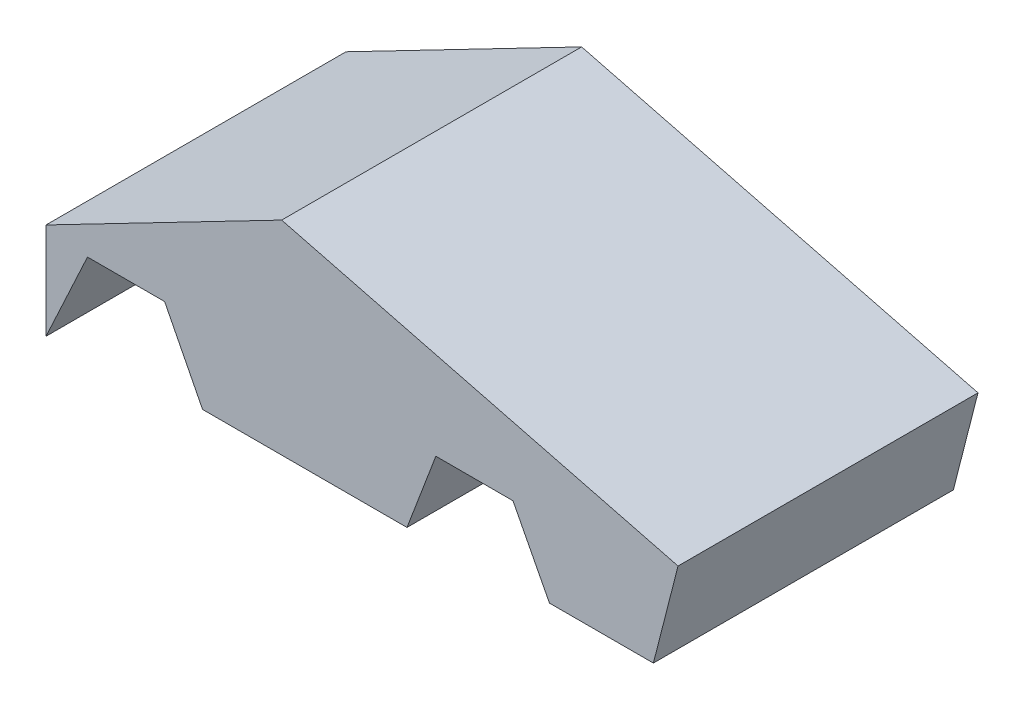
ISO-10303-21;
HEADER;
FILE_DESCRIPTION(('STEP AP214'),'2;1');
FILE_NAME('part.step','',(''),(''),'','','');
FILE_SCHEMA(('AUTOMOTIVE_DESIGN { 1 0 10303 214 1 1 1 1 }'));
ENDSEC;
DATA;
#1=APPLICATION_CONTEXT('core data for automotive mechanical design processes');
#2=APPLICATION_PROTOCOL_DEFINITION('international standard','automotive_design',2000,#1);
#3=PRODUCT_CONTEXT('',#1,'mechanical');
#4=PRODUCT('Part','Part','',(#3));
#5=PRODUCT_RELATED_PRODUCT_CATEGORY('part','',(#4));
#6=PRODUCT_DEFINITION_FORMATION('','',#4);
#7=PRODUCT_DEFINITION_CONTEXT('part definition',#1,'design');
#8=PRODUCT_DEFINITION('design','',#6,#7);
#9=PRODUCT_DEFINITION_SHAPE('','',#8);
#10=(LENGTH_UNIT() NAMED_UNIT(*) SI_UNIT(.MILLI.,.METRE.));
#11=(NAMED_UNIT(*) PLANE_ANGLE_UNIT() SI_UNIT($,.RADIAN.));
#12=(NAMED_UNIT(*) SI_UNIT($,.STERADIAN.) SOLID_ANGLE_UNIT());
#13=UNCERTAINTY_MEASURE_WITH_UNIT(LENGTH_MEASURE(1.E-05),#10,'distance_accuracy_value','');
#14=(GEOMETRIC_REPRESENTATION_CONTEXT(3) GLOBAL_UNCERTAINTY_ASSIGNED_CONTEXT((#13)) GLOBAL_UNIT_ASSIGNED_CONTEXT((#10,
#11,#12)) REPRESENTATION_CONTEXT('',''));
#15=CARTESIAN_POINT('',(0.,0.,0.));
#16=DIRECTION('',(0.,0.,1.));
#17=DIRECTION('',(1.,0.,0.));
#18=AXIS2_PLACEMENT_3D('',#15,#16,#17);
#19=CARTESIAN_POINT('',(176.391501363352,-13.2896946294836,140.));
#20=DIRECTION('',(0.,1.,0.));
#21=DIRECTION('',(-1.,0.,0.));
#22=AXIS2_PLACEMENT_3D('',#19,#20,#21);
#23=PLANE('',#22);
#24=DIRECTION('',(1.,0.,0.));
#25=VECTOR('',#24,1.);
#26=CARTESIAN_POINT('',(176.391501363352,-13.2896946294836,0.));
#27=LINE('',#26,#25);
#28=CARTESIAN_POINT('',(176.391501363352,-13.2896946294836,0.));
#29=VERTEX_POINT('',#28);
#30=CARTESIAN_POINT('',(212.391501363352,-13.2896946294836,0.));
#31=VERTEX_POINT('',#30);
#32=EDGE_CURVE('E153',#29,#31,#27,.T.);
#33=ORIENTED_EDGE('',*,*,#32,.T.);
#34=DIRECTION('',(0.,0.,-1.));
#35=VECTOR('',#34,1.);
#36=CARTESIAN_POINT('',(212.391501363352,-13.2896946294836,140.));
#37=LINE('',#36,#35);
#38=CARTESIAN_POINT('',(212.391501363352,-13.2896946294836,140.));
#39=VERTEX_POINT('',#38);
#40=EDGE_CURVE('E11',#39,#31,#37,.T.);
#41=ORIENTED_EDGE('',*,*,#40,.F.);
#42=DIRECTION('',(1.,0.,0.));
#43=VECTOR('',#42,1.);
#44=CARTESIAN_POINT('',(176.391501363352,-13.2896946294836,140.));
#45=LINE('',#44,#43);
#46=CARTESIAN_POINT('',(176.391501363352,-13.2896946294836,140.));
#47=VERTEX_POINT('',#46);
#48=EDGE_CURVE('E175',#47,#39,#45,.T.);
#49=ORIENTED_EDGE('',*,*,#48,.F.);
#50=DIRECTION('',(0.,0.,-1.));
#51=VECTOR('',#50,1.);
#52=CARTESIAN_POINT('',(176.391501363352,-13.2896946294836,140.));
#53=LINE('',#52,#51);
#54=EDGE_CURVE('E149',#47,#29,#53,.T.);
#55=ORIENTED_EDGE('',*,*,#54,.T.);
#56=EDGE_LOOP('',(#33,#41,#49,#55));
#57=FACE_BOUND('',#56,.T.);
#58=ADVANCED_FACE('F33',(#57),#23,.F.);
#59=CARTESIAN_POINT('',(212.391501363352,-13.2896946294836,140.));
#60=DIRECTION('',(0.887963935592456,0.459913088623445,0.));
#61=DIRECTION('',(-0.459913088623445,0.887963935592456,0.));
#62=AXIS2_PLACEMENT_3D('',#59,#60,#61);
#63=PLANE('',#62);
#64=DIRECTION('',(0.459913088623445,-0.887963935592456,0.));
#65=VECTOR('',#64,1.);
#66=CARTESIAN_POINT('',(212.391501363352,-13.2896946294836,0.));
#67=LINE('',#66,#65);
#68=CARTESIAN_POINT('',(229.40828564242,-46.1443602464045,0.));
#69=VERTEX_POINT('',#68);
#70=EDGE_CURVE('E156',#31,#69,#67,.T.);
#71=ORIENTED_EDGE('',*,*,#70,.T.);
#72=DIRECTION('',(0.,0.,-1.));
#73=VECTOR('',#72,1.);
#74=CARTESIAN_POINT('',(229.40828564242,-46.1443602464045,140.));
#75=LINE('',#74,#73);
#76=CARTESIAN_POINT('',(229.40828564242,-46.1443602464045,140.));
#77=VERTEX_POINT('',#76);
#78=EDGE_CURVE('E41',#77,#69,#75,.T.);
#79=ORIENTED_EDGE('',*,*,#78,.F.);
#80=DIRECTION('',(0.459913088623445,-0.887963935592456,0.));
#81=VECTOR('',#80,1.);
#82=CARTESIAN_POINT('',(212.391501363352,-13.2896946294836,140.));
#83=LINE('',#82,#81);
#84=EDGE_CURVE('E104',#39,#77,#83,.T.);
#85=ORIENTED_EDGE('',*,*,#84,.F.);
#86=ORIENTED_EDGE('',*,*,#40,.T.);
#87=EDGE_LOOP('',(#71,#79,#85,#86));
#88=FACE_BOUND('',#87,.T.);
#89=ADVANCED_FACE('F253',(#88),#63,.F.);
#90=CARTESIAN_POINT('',(229.40828564242,-46.1443602464045,140.));
#91=DIRECTION('',(0.,1.,0.));
#92=DIRECTION('',(-1.,0.,0.));
#93=AXIS2_PLACEMENT_3D('',#90,#91,#92);
#94=PLANE('',#93);
#95=DIRECTION('',(1.,0.,0.));
#96=VECTOR('',#95,1.);
#97=CARTESIAN_POINT('',(229.40828564242,-46.1443602464045,0.));
#98=LINE('',#97,#96);
#99=CARTESIAN_POINT('',(277.919749318649,-46.1443602464045,0.));
#100=VERTEX_POINT('',#99);
#101=EDGE_CURVE('E158',#69,#100,#98,.T.);
#102=ORIENTED_EDGE('',*,*,#101,.T.);
#103=DIRECTION('',(0.,0.,-1.));
#104=VECTOR('',#103,1.);
#105=CARTESIAN_POINT('',(277.919749318649,-46.1443602464045,140.));
#106=LINE('',#105,#104);
#107=CARTESIAN_POINT('',(277.919749318649,-46.1443602464045,140.));
#108=VERTEX_POINT('',#107);
#109=EDGE_CURVE('E194',#108,#100,#106,.T.);
#110=ORIENTED_EDGE('',*,*,#109,.F.);
#111=DIRECTION('',(1.,0.,0.));
#112=VECTOR('',#111,1.);
#113=CARTESIAN_POINT('',(229.40828564242,-46.1443602464045,140.));
#114=LINE('',#113,#112);
#115=EDGE_CURVE('E202',#77,#108,#114,.T.);
#116=ORIENTED_EDGE('',*,*,#115,.F.);
#117=ORIENTED_EDGE('',*,*,#78,.T.);
#118=EDGE_LOOP('',(#102,#110,#116,#117));
#119=FACE_BOUND('',#118,.T.);
#120=ADVANCED_FACE('F200',(#119),#94,.F.);
#121=CARTESIAN_POINT('',(289.431663255081,-1.14436024640451,140.));
#122=DIRECTION('',(-0.968801225938162,0.247839029655773,0.));
#123=DIRECTION('',(-0.247839029655773,-0.968801225938162,0.));
#124=AXIS2_PLACEMENT_3D('',#121,#122,#123);
#125=PLANE('',#124);
#126=DIRECTION('',(0.247839029655773,0.968801225938162,0.));
#127=VECTOR('',#126,1.);
#128=CARTESIAN_POINT('',(289.431663255081,-1.14436024640451,0.));
#129=LINE('',#128,#127);
#130=CARTESIAN_POINT('',(289.431663255081,-1.14436024640451,0.));
#131=VERTEX_POINT('',#130);
#132=EDGE_CURVE('E160',#100,#131,#129,.T.);
#133=ORIENTED_EDGE('',*,*,#132,.T.);
#134=DIRECTION('',(0.,0.,-1.));
#135=VECTOR('',#134,1.);
#136=CARTESIAN_POINT('',(289.431663255081,-1.14436024640451,140.));
#137=LINE('',#136,#135);
#138=CARTESIAN_POINT('',(289.431663255081,-1.14436024640451,140.));
#139=VERTEX_POINT('',#138);
#140=EDGE_CURVE('E191',#139,#131,#137,.T.);
#141=ORIENTED_EDGE('',*,*,#140,.F.);
#142=DIRECTION('',(0.247839029655773,0.968801225938162,0.));
#143=VECTOR('',#142,1.);
#144=CARTESIAN_POINT('',(289.431663255081,-1.14436024640451,140.));
#145=LINE('',#144,#143);
#146=EDGE_CURVE('E220',#108,#139,#145,.T.);
#147=ORIENTED_EDGE('',*,*,#146,.F.);
#148=ORIENTED_EDGE('',*,*,#109,.T.);
#149=EDGE_LOOP('',(#133,#141,#147,#148));
#150=FACE_BOUND('',#149,.T.);
#151=ADVANCED_FACE('F211',(#150),#125,.F.);
#152=CARTESIAN_POINT('',(104.431663255081,46.1823970478152,140.));
#153=DIRECTION('',(-0.247839029655772,-0.968801225938162,0.));
#154=DIRECTION('',(0.968801225938162,-0.247839029655772,0.));
#155=AXIS2_PLACEMENT_3D('',#152,#153,#154);
#156=PLANE('',#155);
#157=DIRECTION('',(-0.968801225938162,0.247839029655772,0.));
#158=VECTOR('',#157,1.);
#159=CARTESIAN_POINT('',(104.431663255081,46.1823970478152,0.));
#160=LINE('',#159,#158);
#161=CARTESIAN_POINT('',(104.431663255081,46.1823970478152,0.));
#162=VERTEX_POINT('',#161);
#163=EDGE_CURVE('E162',#131,#162,#160,.T.);
#164=ORIENTED_EDGE('',*,*,#163,.T.);
#165=DIRECTION('',(0.,0.,-1.));
#166=VECTOR('',#165,1.);
#167=CARTESIAN_POINT('',(104.431663255081,46.1823970478152,140.));
#168=LINE('',#167,#166);
#169=CARTESIAN_POINT('',(104.431663255081,46.1823970478152,140.));
#170=VERTEX_POINT('',#169);
#171=EDGE_CURVE('E188',#170,#162,#168,.T.);
#172=ORIENTED_EDGE('',*,*,#171,.F.);
#173=DIRECTION('',(-0.968801225938162,0.247839029655772,0.));
#174=VECTOR('',#173,1.);
#175=CARTESIAN_POINT('',(104.431663255081,46.1823970478152,140.));
#176=LINE('',#175,#174);
#177=EDGE_CURVE('E217',#139,#170,#176,.T.);
#178=ORIENTED_EDGE('',*,*,#177,.F.);
#179=ORIENTED_EDGE('',*,*,#140,.T.);
#180=EDGE_LOOP('',(#164,#172,#178,#179));
#181=FACE_BOUND('',#180,.T.);
#182=ADVANCED_FACE('F215',(#181),#156,.F.);
#183=CARTESIAN_POINT('',(104.431663255081,46.1823970478152,140.));
#184=DIRECTION('',(0.459913088623445,-0.887963935592456,0.));
#185=DIRECTION('',(0.887963935592456,0.459913088623445,0.));
#186=AXIS2_PLACEMENT_3D('',#183,#184,#185);
#187=PLANE('',#186);
#188=DIRECTION('',(-0.887963935592456,-0.459913088623445,0.));
#189=VECTOR('',#188,1.);
#190=CARTESIAN_POINT('',(104.431663255081,46.1823970478152,0.));
#191=LINE('',#190,#189);
#192=CARTESIAN_POINT('',(-5.56833674491933,-10.7911327553121,0.));
#193=VERTEX_POINT('',#192);
#194=EDGE_CURVE('E164',#162,#193,#191,.T.);
#195=ORIENTED_EDGE('',*,*,#194,.T.);
#196=DIRECTION('',(0.,0.,-1.));
#197=VECTOR('',#196,1.);
#198=CARTESIAN_POINT('',(-5.56833674491933,-10.7911327553121,140.));
#199=LINE('',#198,#197);
#200=CARTESIAN_POINT('',(-5.56833674491933,-10.7911327553121,140.));
#201=VERTEX_POINT('',#200);
#202=EDGE_CURVE('E185',#201,#193,#199,.T.);
#203=ORIENTED_EDGE('',*,*,#202,.F.);
#204=DIRECTION('',(-0.887963935592456,-0.459913088623445,0.));
#205=VECTOR('',#204,1.);
#206=CARTESIAN_POINT('',(104.431663255081,46.1823970478152,140.));
#207=LINE('',#206,#205);
#208=EDGE_CURVE('E219',#170,#201,#207,.T.);
#209=ORIENTED_EDGE('',*,*,#208,.F.);
#210=ORIENTED_EDGE('',*,*,#171,.T.);
#211=EDGE_LOOP('',(#195,#203,#209,#210));
#212=FACE_BOUND('',#211,.T.);
#213=ADVANCED_FACE('F266',(#212),#187,.F.);
#214=CARTESIAN_POINT('',(-5.56833674491933,-10.7911327553121,140.));
#215=DIRECTION('',(1.,0.,0.));
#216=DIRECTION('',(0.,1.,0.));
#217=AXIS2_PLACEMENT_3D('',#214,#215,#216);
#218=PLANE('',#217);
#219=DIRECTION('',(0.,-1.,0.));
#220=VECTOR('',#219,1.);
#221=CARTESIAN_POINT('',(-5.56833674491933,-10.7911327553121,0.));
#222=LINE('',#221,#220);
#223=CARTESIAN_POINT('',(-5.56833674491932,-55.7911327553121,0.));
#224=VERTEX_POINT('',#223);
#225=EDGE_CURVE('E166',#193,#224,#222,.T.);
#226=ORIENTED_EDGE('',*,*,#225,.T.);
#227=DIRECTION('',(0.,0.,-1.));
#228=VECTOR('',#227,1.);
#229=CARTESIAN_POINT('',(-5.56833674491932,-55.7911327553121,140.));
#230=LINE('',#229,#228);
#231=CARTESIAN_POINT('',(-5.56833674491932,-55.7911327553121,140.));
#232=VERTEX_POINT('',#231);
#233=EDGE_CURVE('E182',#232,#224,#230,.T.);
#234=ORIENTED_EDGE('',*,*,#233,.F.);
#235=DIRECTION('',(0.,-1.,0.));
#236=VECTOR('',#235,1.);
#237=CARTESIAN_POINT('',(-5.56833674491933,-10.7911327553121,140.));
#238=LINE('',#237,#236);
#239=EDGE_CURVE('E222',#201,#232,#238,.T.);
#240=ORIENTED_EDGE('',*,*,#239,.F.);
#241=ORIENTED_EDGE('',*,*,#202,.T.);
#242=EDGE_LOOP('',(#226,#234,#240,#241));
#243=FACE_BOUND('',#242,.T.);
#244=ADVANCED_FACE('F269',(#243),#218,.F.);
#245=CARTESIAN_POINT('',(-5.56833674491932,-55.7911327553121,140.));
#246=DIRECTION('',(-0.907021260440029,0.421084828876298,0.));
#247=DIRECTION('',(-0.421084828876298,-0.907021260440029,0.));
#248=AXIS2_PLACEMENT_3D('',#245,#246,#247);
#249=PLANE('',#248);
#250=DIRECTION('',(0.421084828876298,0.907021260440029,0.));
#251=VECTOR('',#250,1.);
#252=CARTESIAN_POINT('',(-5.56833674491932,-55.7911327553121,0.));
#253=LINE('',#252,#251);
#254=CARTESIAN_POINT('',(13.8015653833904,-14.0681547750708,0.));
#255=VERTEX_POINT('',#254);
#256=EDGE_CURVE('E168',#224,#255,#253,.T.);
#257=ORIENTED_EDGE('',*,*,#256,.T.);
#258=DIRECTION('',(0.,0.,-1.));
#259=VECTOR('',#258,1.);
#260=CARTESIAN_POINT('',(13.8015653833904,-14.0681547750708,140.));
#261=LINE('',#260,#259);
#262=CARTESIAN_POINT('',(13.8015653833904,-14.0681547750708,140.));
#263=VERTEX_POINT('',#262);
#264=EDGE_CURVE('E179',#263,#255,#261,.T.);
#265=ORIENTED_EDGE('',*,*,#264,.F.);
#266=DIRECTION('',(0.421084828876298,0.907021260440029,0.));
#267=VECTOR('',#266,1.);
#268=CARTESIAN_POINT('',(-5.56833674491932,-55.7911327553121,140.));
#269=LINE('',#268,#267);
#270=EDGE_CURVE('E228',#232,#263,#269,.T.);
#271=ORIENTED_EDGE('',*,*,#270,.F.);
#272=ORIENTED_EDGE('',*,*,#233,.T.);
#273=EDGE_LOOP('',(#257,#265,#271,#272));
#274=FACE_BOUND('',#273,.T.);
#275=ADVANCED_FACE('F234',(#274),#249,.F.);
#276=CARTESIAN_POINT('',(13.8015653833904,-14.0681547750708,140.));
#277=DIRECTION('',(0.,1.,0.));
#278=DIRECTION('',(0.,0.,1.));
#279=AXIS2_PLACEMENT_3D('',#276,#277,#278);
#280=PLANE('',#279);
#281=DIRECTION('',(1.,0.,0.));
#282=VECTOR('',#281,1.);
#283=CARTESIAN_POINT('',(13.8015653833904,-14.0681547750708,0.));
#284=LINE('',#283,#282);
#285=CARTESIAN_POINT('',(49.8015653833904,-14.0681547750708,0.));
#286=VERTEX_POINT('',#285);
#287=EDGE_CURVE('E170',#255,#286,#284,.T.);
#288=ORIENTED_EDGE('',*,*,#287,.T.);
#289=DIRECTION('',(0.,0.,-1.));
#290=VECTOR('',#289,1.);
#291=CARTESIAN_POINT('',(49.8015653833904,-14.0681547750708,140.));
#292=LINE('',#291,#290);
#293=CARTESIAN_POINT('',(49.8015653833904,-14.0681547750708,140.));
#294=VERTEX_POINT('',#293);
#295=EDGE_CURVE('E144',#294,#286,#292,.T.);
#296=ORIENTED_EDGE('',*,*,#295,.F.);
#297=DIRECTION('',(1.,0.,0.));
#298=VECTOR('',#297,1.);
#299=CARTESIAN_POINT('',(13.8015653833904,-14.0681547750708,140.));
#300=LINE('',#299,#298);
#301=EDGE_CURVE('E135',#263,#294,#300,.T.);
#302=ORIENTED_EDGE('',*,*,#301,.F.);
#303=ORIENTED_EDGE('',*,*,#264,.T.);
#304=EDGE_LOOP('',(#288,#296,#302,#303));
#305=FACE_BOUND('',#304,.T.);
#306=ADVANCED_FACE('F238',(#305),#280,.F.);
#307=CARTESIAN_POINT('',(49.8015653833904,-14.0681547750708,140.));
#308=DIRECTION('',(0.891079698783612,0.453846857888987,0.));
#309=DIRECTION('',(-0.453846857888987,0.891079698783612,0.));
#310=AXIS2_PLACEMENT_3D('',#307,#308,#309);
#311=PLANE('',#310);
#312=DIRECTION('',(0.453846857888987,-0.891079698783612,0.));
#313=VECTOR('',#312,1.);
#314=CARTESIAN_POINT('',(49.8015653833904,-14.0681547750708,0.));
#315=LINE('',#314,#313);
#316=CARTESIAN_POINT('',(67.5015928410609,-48.8202630276316,0.));
#317=VERTEX_POINT('',#316);
#318=EDGE_CURVE('E143',#286,#317,#315,.T.);
#319=ORIENTED_EDGE('',*,*,#318,.T.);
#320=DIRECTION('',(0.,0.,-1.));
#321=VECTOR('',#320,1.);
#322=CARTESIAN_POINT('',(67.5015928410609,-48.8202630276316,140.));
#323=LINE('',#322,#321);
#324=CARTESIAN_POINT('',(67.5015928410609,-48.8202630276316,140.));
#325=VERTEX_POINT('',#324);
#326=EDGE_CURVE('E140',#325,#317,#323,.T.);
#327=ORIENTED_EDGE('',*,*,#326,.F.);
#328=DIRECTION('',(0.453846857888987,-0.891079698783612,0.));
#329=VECTOR('',#328,1.);
#330=CARTESIAN_POINT('',(49.8015653833904,-14.0681547750708,140.));
#331=LINE('',#330,#329);
#332=EDGE_CURVE('E129',#294,#325,#331,.T.);
#333=ORIENTED_EDGE('',*,*,#332,.F.);
#334=ORIENTED_EDGE('',*,*,#295,.T.);
#335=EDGE_LOOP('',(#319,#327,#333,#334));
#336=FACE_BOUND('',#335,.T.);
#337=ADVANCED_FACE('F141',(#336),#311,.F.);
#338=CARTESIAN_POINT('',(67.5015928410609,-48.8202630276316,140.));
#339=DIRECTION('',(0.,1.,0.));
#340=DIRECTION('',(0.,0.,1.));
#341=AXIS2_PLACEMENT_3D('',#338,#339,#340);
#342=PLANE('',#341);
#343=DIRECTION('',(1.,0.,0.));
#344=VECTOR('',#343,1.);
#345=CARTESIAN_POINT('',(67.5015928410609,-48.8202630276316,0.));
#346=LINE('',#345,#344);
#347=CARTESIAN_POINT('',(162.916386918401,-48.8202630276316,0.));
#348=VERTEX_POINT('',#347);
#349=EDGE_CURVE('E90',#317,#348,#346,.T.);
#350=ORIENTED_EDGE('',*,*,#349,.T.);
#351=DIRECTION('',(0.,0.,-1.));
#352=VECTOR('',#351,1.);
#353=CARTESIAN_POINT('',(162.916386918401,-48.8202630276316,140.));
#354=LINE('',#353,#352);
#355=CARTESIAN_POINT('',(162.916386918401,-48.8202630276316,140.));
#356=VERTEX_POINT('',#355);
#357=EDGE_CURVE('E145',#356,#348,#354,.T.);
#358=ORIENTED_EDGE('',*,*,#357,.F.);
#359=DIRECTION('',(1.,0.,0.));
#360=VECTOR('',#359,1.);
#361=CARTESIAN_POINT('',(67.5015928410609,-48.8202630276316,140.));
#362=LINE('',#361,#360);
#363=EDGE_CURVE('E133',#325,#356,#362,.T.);
#364=ORIENTED_EDGE('',*,*,#363,.F.);
#365=ORIENTED_EDGE('',*,*,#326,.T.);
#366=EDGE_LOOP('',(#350,#358,#364,#365));
#367=FACE_BOUND('',#366,.T.);
#368=ADVANCED_FACE('F147',(#367),#342,.F.);
#369=CARTESIAN_POINT('',(162.916386918401,-48.8202630276316,140.));
#370=DIRECTION('',(-0.935014957846,0.354608274867132,0.));
#371=DIRECTION('',(-0.354608274867132,-0.935014957846,0.));
#372=AXIS2_PLACEMENT_3D('',#369,#370,#371);
#373=PLANE('',#372);
#374=DIRECTION('',(0.354608274867132,0.935014957845999,0.));
#375=VECTOR('',#374,1.);
#376=CARTESIAN_POINT('',(162.916386918401,-48.8202630276316,0.));
#377=LINE('',#376,#375);
#378=EDGE_CURVE('E96',#348,#29,#377,.T.);
#379=ORIENTED_EDGE('',*,*,#378,.T.);
#380=ORIENTED_EDGE('',*,*,#54,.F.);
#381=DIRECTION('',(0.354608274867132,0.935014957845999,0.));
#382=VECTOR('',#381,1.);
#383=CARTESIAN_POINT('',(162.916386918401,-48.8202630276316,140.));
#384=LINE('',#383,#382);
#385=EDGE_CURVE('E49',#356,#47,#384,.T.);
#386=ORIENTED_EDGE('',*,*,#385,.F.);
#387=ORIENTED_EDGE('',*,*,#357,.T.);
#388=EDGE_LOOP('',(#379,#380,#386,#387));
#389=FACE_BOUND('',#388,.T.);
#390=ADVANCED_FACE('F242',(#389),#373,.F.);
#391=CARTESIAN_POINT('',(0.,0.,140.));
#392=DIRECTION('',(0.,0.,-1.));
#393=DIRECTION('',(-1.,0.,0.));
#394=AXIS2_PLACEMENT_3D('',#391,#392,#393);
#395=PLANE('',#394);
#396=ORIENTED_EDGE('',*,*,#48,.T.);
#397=ORIENTED_EDGE('',*,*,#84,.T.);
#398=ORIENTED_EDGE('',*,*,#115,.T.);
#399=ORIENTED_EDGE('',*,*,#146,.T.);
#400=ORIENTED_EDGE('',*,*,#177,.T.);
#401=ORIENTED_EDGE('',*,*,#208,.T.);
#402=ORIENTED_EDGE('',*,*,#239,.T.);
#403=ORIENTED_EDGE('',*,*,#270,.T.);
#404=ORIENTED_EDGE('',*,*,#301,.T.);
#405=ORIENTED_EDGE('',*,*,#332,.T.);
#406=ORIENTED_EDGE('',*,*,#363,.T.);
#407=ORIENTED_EDGE('',*,*,#385,.T.);
#408=EDGE_LOOP('',(#396,#397,#398,#399,#400,#401,#402,#403,#404,#405,#406,#407));
#409=FACE_BOUND('',#408,.T.);
#410=ADVANCED_FACE('F131',(#409),#395,.F.);
#411=CARTESIAN_POINT('',(0.,0.,0.));
#412=DIRECTION('',(0.,0.,-1.));
#413=DIRECTION('',(-1.,0.,0.));
#414=AXIS2_PLACEMENT_3D('',#411,#412,#413);
#415=PLANE('',#414);
#416=ORIENTED_EDGE('',*,*,#32,.F.);
#417=ORIENTED_EDGE('',*,*,#378,.F.);
#418=ORIENTED_EDGE('',*,*,#349,.F.);
#419=ORIENTED_EDGE('',*,*,#318,.F.);
#420=ORIENTED_EDGE('',*,*,#287,.F.);
#421=ORIENTED_EDGE('',*,*,#256,.F.);
#422=ORIENTED_EDGE('',*,*,#225,.F.);
#423=ORIENTED_EDGE('',*,*,#194,.F.);
#424=ORIENTED_EDGE('',*,*,#163,.F.);
#425=ORIENTED_EDGE('',*,*,#132,.F.);
#426=ORIENTED_EDGE('',*,*,#101,.F.);
#427=ORIENTED_EDGE('',*,*,#70,.F.);
#428=EDGE_LOOP('',(#416,#417,#418,#419,#420,#421,#422,#423,#424,#425,#426,#427));
#429=FACE_BOUND('',#428,.T.);
#430=ADVANCED_FACE('F206',(#429),#415,.T.);
#431=CLOSED_SHELL('',(#58,#89,#120,#151,#182,#213,#244,#275,#306,#337,#368,#390,#410,#430));
#432=MANIFOLD_SOLID_BREP('B2',#431);
#433=ADVANCED_BREP_SHAPE_REPRESENTATION('',(#18,#432),#14);
#434=SHAPE_DEFINITION_REPRESENTATION(#9,#433);
ENDSEC;
END-ISO-10303-21;
